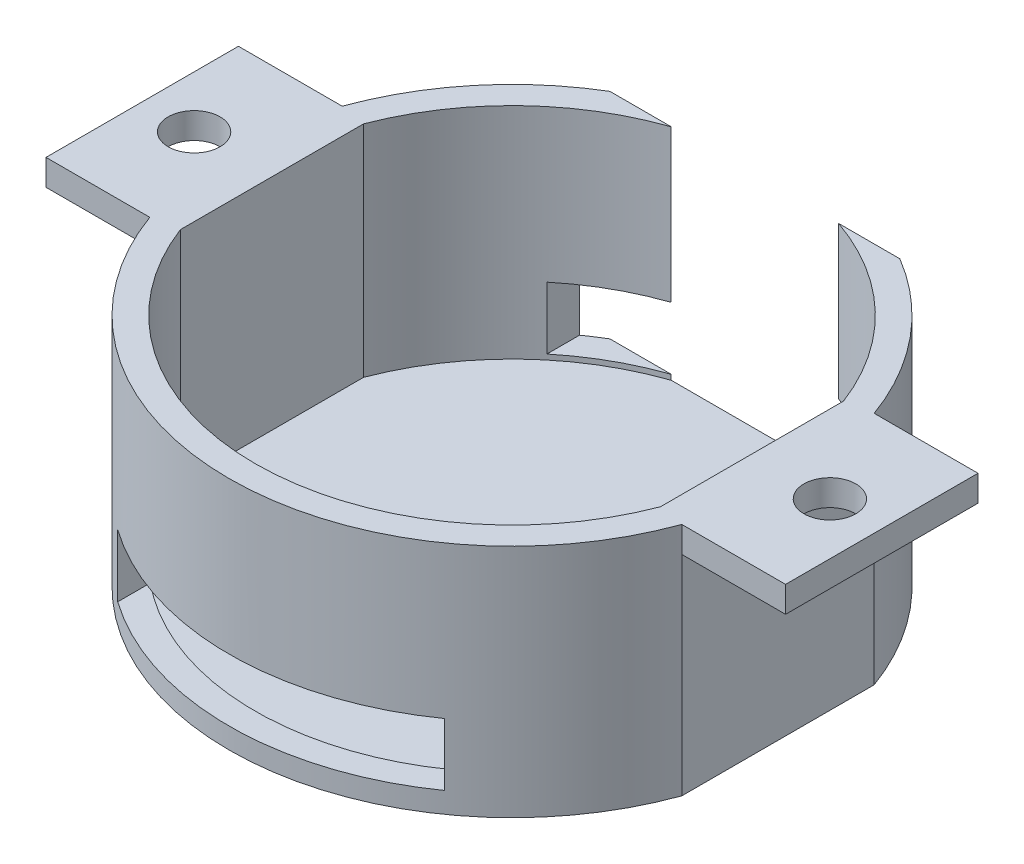
ISO-10303-21;
HEADER;
FILE_DESCRIPTION(('STEP AP214'),'2;1');
FILE_NAME('part.step','',(''),(''),'','','');
FILE_SCHEMA(('AUTOMOTIVE_DESIGN { 1 0 10303 214 1 1 1 1 }'));
ENDSEC;
DATA;
#1=APPLICATION_CONTEXT('core data for automotive mechanical design processes');
#2=APPLICATION_PROTOCOL_DEFINITION('international standard','automotive_design',2000,#1);
#3=PRODUCT_CONTEXT('',#1,'mechanical');
#4=PRODUCT('Part','Part','',(#3));
#5=PRODUCT_RELATED_PRODUCT_CATEGORY('part','',(#4));
#6=PRODUCT_DEFINITION_FORMATION('','',#4);
#7=PRODUCT_DEFINITION_CONTEXT('part definition',#1,'design');
#8=PRODUCT_DEFINITION('design','',#6,#7);
#9=PRODUCT_DEFINITION_SHAPE('','',#8);
#10=(LENGTH_UNIT() NAMED_UNIT(*) SI_UNIT(.MILLI.,.METRE.));
#11=(NAMED_UNIT(*) PLANE_ANGLE_UNIT() SI_UNIT($,.RADIAN.));
#12=(NAMED_UNIT(*) SI_UNIT($,.STERADIAN.) SOLID_ANGLE_UNIT());
#13=UNCERTAINTY_MEASURE_WITH_UNIT(LENGTH_MEASURE(1.E-05),#10,'distance_accuracy_value','');
#14=(GEOMETRIC_REPRESENTATION_CONTEXT(3) GLOBAL_UNCERTAINTY_ASSIGNED_CONTEXT((#13)) GLOBAL_UNIT_ASSIGNED_CONTEXT((#10,
#11,#12)) REPRESENTATION_CONTEXT('',''));
#15=CARTESIAN_POINT('',(0.,0.,0.));
#16=DIRECTION('',(0.,0.,1.));
#17=DIRECTION('',(1.,0.,0.));
#18=AXIS2_PLACEMENT_3D('',#15,#16,#17);
#19=CARTESIAN_POINT('',(-31.477498370648,1.,54.5));
#20=DIRECTION('',(0.,-1.,0.));
#21=DIRECTION('',(1.,0.,0.));
#22=AXIS2_PLACEMENT_3D('',#19,#20,#21);
#23=PLANE('',#22);
#24=CARTESIAN_POINT('',(0.,0.999999999999994,0.));
#25=DIRECTION('',(0.,-1.,0.));
#26=DIRECTION('',(1.,0.,0.));
#27=AXIS2_PLACEMENT_3D('',#24,#25,#26);
#28=CIRCLE('',#27,54.5);
#29=CARTESIAN_POINT('',(27.9257797262097,0.99999999999999,-46.8017182022543));
#30=VERTEX_POINT('',#29);
#31=CARTESIAN_POINT('',(31.477498370648,0.999999999999992,-44.4906405474888));
#32=VERTEX_POINT('',#31);
#33=EDGE_CURVE('E432',#30,#32,#28,.T.);
#34=ORIENTED_EDGE('',*,*,#33,.F.);
#35=DIRECTION('',(-1.,0.,0.));
#36=VECTOR('',#35,1.);
#37=CARTESIAN_POINT('',(-31.477498370648,1.,-46.8017182022543));
#38=LINE('',#37,#36);
#39=CARTESIAN_POINT('',(16.119837881219,0.999999999999994,-46.8017182022542));
#40=VERTEX_POINT('',#39);
#41=EDGE_CURVE('E383',#30,#40,#38,.T.);
#42=ORIENTED_EDGE('',*,*,#41,.T.);
#43=CARTESIAN_POINT('',(0.,0.999999999999994,0.));
#44=DIRECTION('',(0.,-1.,0.));
#45=DIRECTION('',(1.,0.,0.));
#46=AXIS2_PLACEMENT_3D('',#43,#44,#45);
#47=CIRCLE('',#46,49.5);
#48=CARTESIAN_POINT('',(31.477498370648,0.999999999999992,-38.2023179444109));
#49=VERTEX_POINT('',#48);
#50=EDGE_CURVE('E367',#40,#49,#47,.T.);
#51=ORIENTED_EDGE('',*,*,#50,.T.);
#52=DIRECTION('',(0.,0.,-1.));
#53=VECTOR('',#52,1.);
#54=CARTESIAN_POINT('',(31.477498370648,0.999999999999992,54.5));
#55=LINE('',#54,#53);
#56=EDGE_CURVE('E387',#49,#32,#55,.T.);
#57=ORIENTED_EDGE('',*,*,#56,.T.);
#58=EDGE_LOOP('',(#34,#42,#51,#57));
#59=FACE_BOUND('',#58,.T.);
#60=ADVANCED_FACE('F43',(#59),#23,.F.);
#61=CARTESIAN_POINT('',(31.477498370648,13.,54.5));
#62=DIRECTION('',(0.,1.,0.));
#63=DIRECTION('',(-1.,0.,0.));
#64=AXIS2_PLACEMENT_3D('',#61,#62,#63);
#65=PLANE('',#64);
#66=CARTESIAN_POINT('',(0.,13.,0.));
#67=DIRECTION('',(0.,1.,0.));
#68=DIRECTION('',(-1.,0.,0.));
#69=AXIS2_PLACEMENT_3D('',#66,#67,#68);
#70=CIRCLE('',#69,54.5);
#71=CARTESIAN_POINT('',(-27.9257797262097,13.,-46.8017182022542));
#72=VERTEX_POINT('',#71);
#73=CARTESIAN_POINT('',(-31.477498370648,13.,-44.4906405474888));
#74=VERTEX_POINT('',#73);
#75=EDGE_CURVE('E416',#72,#74,#70,.T.);
#76=ORIENTED_EDGE('',*,*,#75,.F.);
#77=DIRECTION('',(1.,0.,0.));
#78=VECTOR('',#77,1.);
#79=CARTESIAN_POINT('',(31.477498370648,13.,-46.8017182022543));
#80=LINE('',#79,#78);
#81=CARTESIAN_POINT('',(-16.119837881219,13.,-46.8017182022542));
#82=VERTEX_POINT('',#81);
#83=EDGE_CURVE('E243',#72,#82,#80,.T.);
#84=ORIENTED_EDGE('',*,*,#83,.T.);
#85=CARTESIAN_POINT('',(0.,13.,0.));
#86=DIRECTION('',(0.,1.,0.));
#87=DIRECTION('',(-1.,0.,0.));
#88=AXIS2_PLACEMENT_3D('',#85,#86,#87);
#89=CIRCLE('',#88,49.5);
#90=CARTESIAN_POINT('',(-31.477498370648,13.,-38.2023179444109));
#91=VERTEX_POINT('',#90);
#92=EDGE_CURVE('E410',#82,#91,#89,.T.);
#93=ORIENTED_EDGE('',*,*,#92,.T.);
#94=DIRECTION('',(0.,0.,-1.));
#95=VECTOR('',#94,1.);
#96=CARTESIAN_POINT('',(-31.477498370648,13.,54.5));
#97=LINE('',#96,#95);
#98=EDGE_CURVE('E396',#91,#74,#97,.T.);
#99=ORIENTED_EDGE('',*,*,#98,.T.);
#100=EDGE_LOOP('',(#76,#84,#93,#99));
#101=FACE_BOUND('',#100,.T.);
#102=ADVANCED_FACE('F559',(#101),#65,.F.);
#103=CARTESIAN_POINT('',(0.,42.3,0.));
#104=DIRECTION('',(0.,-1.,0.));
#105=DIRECTION('',(0.,0.,-1.));
#106=AXIS2_PLACEMENT_3D('',#103,#104,#105);
#107=CYLINDRICAL_SURFACE('',#106,49.5);
#108=DIRECTION('',(0.,-1.,0.));
#109=VECTOR('',#108,1.);
#110=CARTESIAN_POINT('',(-16.119837881219,42.3,-46.8017182022542));
#111=LINE('',#110,#109);
#112=CARTESIAN_POINT('',(-16.119837881219,42.3,-46.8017182022542));
#113=VERTEX_POINT('',#112);
#114=EDGE_CURVE('E374',#113,#82,#111,.T.);
#115=ORIENTED_EDGE('',*,*,#114,.F.);
#116=CARTESIAN_POINT('',(0.,42.3,0.));
#117=DIRECTION('',(0.,1.,0.));
#118=DIRECTION('',(0.,0.,1.));
#119=AXIS2_PLACEMENT_3D('',#116,#117,#118);
#120=CIRCLE('',#119,49.5);
#121=CARTESIAN_POINT('',(-46.25,42.3,-17.6405073623181));
#122=VERTEX_POINT('',#121);
#123=EDGE_CURVE('E258',#113,#122,#120,.T.);
#124=ORIENTED_EDGE('',*,*,#123,.T.);
#125=DIRECTION('',(0.,-1.,0.));
#126=VECTOR('',#125,1.);
#127=CARTESIAN_POINT('',(-46.25,42.3,-17.6405073623181));
#128=LINE('',#127,#126);
#129=CARTESIAN_POINT('',(-46.25,0.,-17.6405073623181));
#130=VERTEX_POINT('',#129);
#131=EDGE_CURVE('E267',#122,#130,#128,.T.);
#132=ORIENTED_EDGE('',*,*,#131,.T.);
#133=CARTESIAN_POINT('',(0.,0.,0.));
#134=DIRECTION('',(0.,1.,0.));
#135=DIRECTION('',(0.,0.,1.));
#136=AXIS2_PLACEMENT_3D('',#133,#134,#135);
#137=CIRCLE('',#136,49.5);
#138=CARTESIAN_POINT('',(-16.119837881219,0.,-46.8017182022542));
#139=VERTEX_POINT('',#138);
#140=EDGE_CURVE('E299',#139,#130,#137,.T.);
#141=ORIENTED_EDGE('',*,*,#140,.F.);
#142=CARTESIAN_POINT('',(-16.119837881219,0.999999999999994,-46.8017182022542));
#143=VERTEX_POINT('',#142);
#144=EDGE_CURVE('E353',#143,#139,#111,.T.);
#145=ORIENTED_EDGE('',*,*,#144,.F.);
#146=CARTESIAN_POINT('',(-31.477498370648,1.,-38.2023179444109));
#147=VERTEX_POINT('',#146);
#148=EDGE_CURVE('E428',#147,#143,#47,.T.);
#149=ORIENTED_EDGE('',*,*,#148,.F.);
#150=DIRECTION('',(0.,-1.,0.));
#151=VECTOR('',#150,1.);
#152=CARTESIAN_POINT('',(-31.477498370648,42.3,-38.2023179444109));
#153=LINE('',#152,#151);
#154=EDGE_CURVE('E402',#91,#147,#153,.T.);
#155=ORIENTED_EDGE('',*,*,#154,.F.);
#156=ORIENTED_EDGE('',*,*,#92,.F.);
#157=EDGE_LOOP('',(#115,#124,#132,#141,#145,#149,#155,#156));
#158=FACE_BOUND('',#157,.T.);
#159=ADVANCED_FACE('F351',(#158),#107,.F.);
#160=CARTESIAN_POINT('',(0.,42.3,0.));
#161=DIRECTION('',(0.,1.,0.));
#162=DIRECTION('',(0.,0.,1.));
#163=AXIS2_PLACEMENT_3D('',#160,#161,#162);
#164=PLANE('',#163);
#165=DIRECTION('',(-1.,0.,0.));
#166=VECTOR('',#165,1.);
#167=CARTESIAN_POINT('',(-27.9257797262097,42.3,-46.8017182022542));
#168=LINE('',#167,#166);
#169=CARTESIAN_POINT('',(-27.9257797262097,42.3,-46.8017182022542));
#170=VERTEX_POINT('',#169);
#171=EDGE_CURVE('E60',#113,#170,#168,.T.);
#172=ORIENTED_EDGE('',*,*,#171,.T.);
#173=CARTESIAN_POINT('',(0.,42.3,0.));
#174=DIRECTION('',(0.,1.,0.));
#175=DIRECTION('',(0.,0.,1.));
#176=AXIS2_PLACEMENT_3D('',#173,#174,#175);
#177=CIRCLE('',#176,54.5);
#178=CARTESIAN_POINT('',(-51.25,42.3,-18.5388106414624));
#179=VERTEX_POINT('',#178);
#180=EDGE_CURVE('E255',#170,#179,#177,.T.);
#181=ORIENTED_EDGE('',*,*,#180,.T.);
#182=DIRECTION('',(1.,0.,0.));
#183=VECTOR('',#182,1.);
#184=CARTESIAN_POINT('',(-71.25,42.3,-18.5388106414624));
#185=LINE('',#184,#183);
#186=CARTESIAN_POINT('',(-71.25,42.3,-18.5388106414624));
#187=VERTEX_POINT('',#186);
#188=EDGE_CURVE('E482',#187,#179,#185,.T.);
#189=ORIENTED_EDGE('',*,*,#188,.F.);
#190=DIRECTION('',(0.,0.,-1.));
#191=VECTOR('',#190,1.);
#192=CARTESIAN_POINT('',(-71.25,42.3,-18.5388106414624));
#193=LINE('',#192,#191);
#194=CARTESIAN_POINT('',(-71.25,42.3,18.5388106414624));
#195=VERTEX_POINT('',#194);
#196=EDGE_CURVE('E480',#195,#187,#193,.T.);
#197=ORIENTED_EDGE('',*,*,#196,.F.);
#198=DIRECTION('',(1.,0.,0.));
#199=VECTOR('',#198,1.);
#200=CARTESIAN_POINT('',(-71.25,42.3,18.5388106414624));
#201=LINE('',#200,#199);
#202=CARTESIAN_POINT('',(-51.25,42.3,18.5388106414624));
#203=VERTEX_POINT('',#202);
#204=EDGE_CURVE('E486',#195,#203,#201,.T.);
#205=ORIENTED_EDGE('',*,*,#204,.T.);
#206=CARTESIAN_POINT('',(0.,42.3,0.));
#207=DIRECTION('',(0.,1.,0.));
#208=DIRECTION('',(0.,0.,1.));
#209=AXIS2_PLACEMENT_3D('',#206,#207,#208);
#210=CIRCLE('',#209,54.5);
#211=CARTESIAN_POINT('',(51.25,42.3,18.5388106414624));
#212=VERTEX_POINT('',#211);
#213=EDGE_CURVE('E270',#203,#212,#210,.T.);
#214=ORIENTED_EDGE('',*,*,#213,.T.);
#215=DIRECTION('',(-1.,0.,0.));
#216=VECTOR('',#215,1.);
#217=CARTESIAN_POINT('',(71.25,42.3,18.5388106414624));
#218=LINE('',#217,#216);
#219=CARTESIAN_POINT('',(71.25,42.3,18.5388106414624));
#220=VERTEX_POINT('',#219);
#221=EDGE_CURVE('E458',#220,#212,#218,.T.);
#222=ORIENTED_EDGE('',*,*,#221,.F.);
#223=DIRECTION('',(0.,0.,1.));
#224=VECTOR('',#223,1.);
#225=CARTESIAN_POINT('',(71.25,42.3,18.5388106414624));
#226=LINE('',#225,#224);
#227=CARTESIAN_POINT('',(71.25,42.3,-18.5388106414624));
#228=VERTEX_POINT('',#227);
#229=EDGE_CURVE('E456',#228,#220,#226,.T.);
#230=ORIENTED_EDGE('',*,*,#229,.F.);
#231=DIRECTION('',(-1.,0.,0.));
#232=VECTOR('',#231,1.);
#233=CARTESIAN_POINT('',(71.25,42.3,-18.5388106414624));
#234=LINE('',#233,#232);
#235=CARTESIAN_POINT('',(51.25,42.3,-18.5388106414624));
#236=VERTEX_POINT('',#235);
#237=EDGE_CURVE('E463',#228,#236,#234,.T.);
#238=ORIENTED_EDGE('',*,*,#237,.T.);
#239=CARTESIAN_POINT('',(27.9257797262097,42.3,-46.8017182022542));
#240=VERTEX_POINT('',#239);
#241=EDGE_CURVE('E266',#236,#240,#177,.T.);
#242=ORIENTED_EDGE('',*,*,#241,.T.);
#243=CARTESIAN_POINT('',(16.119837881219,42.3,-46.8017182022542));
#244=VERTEX_POINT('',#243);
#245=EDGE_CURVE('E259',#240,#244,#168,.T.);
#246=ORIENTED_EDGE('',*,*,#245,.T.);
#247=CARTESIAN_POINT('',(46.25,42.3,-17.6405073623181));
#248=VERTEX_POINT('',#247);
#249=EDGE_CURVE('E311',#248,#244,#120,.T.);
#250=ORIENTED_EDGE('',*,*,#249,.F.);
#251=DIRECTION('',(0.,0.,-1.));
#252=VECTOR('',#251,1.);
#253=CARTESIAN_POINT('',(46.25,42.3,-17.6405073623181));
#254=LINE('',#253,#252);
#255=CARTESIAN_POINT('',(46.25,42.3,17.6405073623182));
#256=VERTEX_POINT('',#255);
#257=EDGE_CURVE('E319',#256,#248,#254,.T.);
#258=ORIENTED_EDGE('',*,*,#257,.F.);
#259=CARTESIAN_POINT('',(0.,42.3,0.));
#260=DIRECTION('',(0.,1.,0.));
#261=DIRECTION('',(0.,0.,1.));
#262=AXIS2_PLACEMENT_3D('',#259,#260,#261);
#263=CIRCLE('',#262,49.5);
#264=CARTESIAN_POINT('',(-46.25,42.3,17.6405073623181));
#265=VERTEX_POINT('',#264);
#266=EDGE_CURVE('E316',#265,#256,#263,.T.);
#267=ORIENTED_EDGE('',*,*,#266,.F.);
#268=DIRECTION('',(0.,0.,1.));
#269=VECTOR('',#268,1.);
#270=CARTESIAN_POINT('',(-46.25,42.3,-17.6405073623181));
#271=LINE('',#270,#269);
#272=EDGE_CURVE('E314',#122,#265,#271,.T.);
#273=ORIENTED_EDGE('',*,*,#272,.F.);
#274=ORIENTED_EDGE('',*,*,#123,.F.);
#275=EDGE_LOOP('',(#172,#181,#189,#197,#205,#214,#222,#230,#238,#242,#246,#250,#258,#267,#273,#274));
#276=FACE_BOUND('',#275,.T.);
#277=CARTESIAN_POINT('',(61.25,42.3,0.));
#278=DIRECTION('',(0.,1.,0.));
#279=DIRECTION('',(0.,0.,1.));
#280=AXIS2_PLACEMENT_3D('',#277,#278,#279);
#281=CIRCLE('',#280,5.);
#282=CARTESIAN_POINT('',(61.25,42.3,5.));
#283=VERTEX_POINT('',#282);
#284=EDGE_CURVE('E436',#283,#283,#281,.T.);
#285=ORIENTED_EDGE('',*,*,#284,.F.);
#286=EDGE_LOOP('',(#285));
#287=FACE_BOUND('',#286,.T.);
#288=CARTESIAN_POINT('',(-61.25,42.3,0.));
#289=DIRECTION('',(0.,1.,0.));
#290=DIRECTION('',(0.,0.,1.));
#291=AXIS2_PLACEMENT_3D('',#288,#289,#290);
#292=CIRCLE('',#291,5.);
#293=CARTESIAN_POINT('',(-61.25,42.3,5.));
#294=VERTEX_POINT('',#293);
#295=EDGE_CURVE('E442',#294,#294,#292,.T.);
#296=ORIENTED_EDGE('',*,*,#295,.F.);
#297=EDGE_LOOP('',(#296));
#298=FACE_BOUND('',#297,.T.);
#299=ADVANCED_FACE('F252',(#276,#287,#298),#164,.T.);
#300=CARTESIAN_POINT('',(0.,42.3,0.));
#301=DIRECTION('',(0.,-1.,0.));
#302=DIRECTION('',(0.,0.,-1.));
#303=AXIS2_PLACEMENT_3D('',#300,#301,#302);
#304=CYLINDRICAL_SURFACE('',#303,54.5);
#305=CARTESIAN_POINT('',(0.,-3.,0.));
#306=DIRECTION('',(0.,-1.,0.));
#307=DIRECTION('',(0.,0.,-1.));
#308=AXIS2_PLACEMENT_3D('',#305,#306,#307);
#309=CIRCLE('',#308,54.5);
#310=CARTESIAN_POINT('',(27.9257797262097,-3.,-46.8017182022542));
#311=VERTEX_POINT('',#310);
#312=CARTESIAN_POINT('',(51.25,-3.,-18.5388106414624));
#313=VERTEX_POINT('',#312);
#314=EDGE_CURVE('E47',#311,#313,#309,.T.);
#315=ORIENTED_EDGE('',*,*,#314,.F.);
#316=DIRECTION('',(0.,-1.,0.));
#317=VECTOR('',#316,1.);
#318=CARTESIAN_POINT('',(27.9257797262097,42.3,-46.8017182022542));
#319=LINE('',#318,#317);
#320=EDGE_CURVE('E378',#311,#30,#319,.F.);
#321=ORIENTED_EDGE('',*,*,#320,.T.);
#322=ORIENTED_EDGE('',*,*,#33,.T.);
#323=DIRECTION('',(0.,-1.,0.));
#324=VECTOR('',#323,1.);
#325=CARTESIAN_POINT('',(31.477498370648,42.3,-44.4906405474888));
#326=LINE('',#325,#324);
#327=CARTESIAN_POINT('',(31.477498370648,13.,-44.4906405474888));
#328=VERTEX_POINT('',#327);
#329=EDGE_CURVE('E425',#32,#328,#326,.F.);
#330=ORIENTED_EDGE('',*,*,#329,.T.);
#331=CARTESIAN_POINT('',(27.9257797262097,13.,-46.8017182022543));
#332=VERTEX_POINT('',#331);
#333=EDGE_CURVE('E417',#328,#332,#70,.T.);
#334=ORIENTED_EDGE('',*,*,#333,.T.);
#335=EDGE_CURVE('E376',#332,#240,#319,.F.);
#336=ORIENTED_EDGE('',*,*,#335,.T.);
#337=ORIENTED_EDGE('',*,*,#241,.F.);
#338=DIRECTION('',(0.,-1.,0.));
#339=VECTOR('',#338,1.);
#340=CARTESIAN_POINT('',(51.25,42.3,-18.5388106414624));
#341=LINE('',#340,#339);
#342=CARTESIAN_POINT('',(51.25,37.3,-18.5388106414624));
#343=VERTEX_POINT('',#342);
#344=EDGE_CURVE('E278',#236,#343,#341,.T.);
#345=ORIENTED_EDGE('',*,*,#344,.T.);
#346=EDGE_CURVE('E277',#343,#313,#341,.T.);
#347=ORIENTED_EDGE('',*,*,#346,.T.);
#348=EDGE_LOOP('',(#315,#321,#322,#330,#334,#336,#337,#345,#347));
#349=FACE_BOUND('',#348,.T.);
#350=ADVANCED_FACE('F45',(#349),#304,.T.);
#351=ORIENTED_EDGE('',*,*,#180,.F.);
#352=DIRECTION('',(0.,-1.,0.));
#353=VECTOR('',#352,1.);
#354=CARTESIAN_POINT('',(-27.9257797262097,42.3,-46.8017182022542));
#355=LINE('',#354,#353);
#356=EDGE_CURVE('E240',#170,#72,#355,.T.);
#357=ORIENTED_EDGE('',*,*,#356,.T.);
#358=ORIENTED_EDGE('',*,*,#75,.T.);
#359=DIRECTION('',(0.,-1.,0.));
#360=VECTOR('',#359,1.);
#361=CARTESIAN_POINT('',(-31.477498370648,42.3,-44.4906405474888));
#362=LINE('',#361,#360);
#363=CARTESIAN_POINT('',(-31.477498370648,1.,-44.4906405474888));
#364=VERTEX_POINT('',#363);
#365=EDGE_CURVE('E407',#74,#364,#362,.T.);
#366=ORIENTED_EDGE('',*,*,#365,.T.);
#367=CARTESIAN_POINT('',(-27.9257797262097,0.999999999999994,-46.8017182022542));
#368=VERTEX_POINT('',#367);
#369=EDGE_CURVE('E433',#364,#368,#28,.T.);
#370=ORIENTED_EDGE('',*,*,#369,.T.);
#371=CARTESIAN_POINT('',(-27.9257797262097,-3.,-46.8017182022542));
#372=VERTEX_POINT('',#371);
#373=EDGE_CURVE('E248',#368,#372,#355,.T.);
#374=ORIENTED_EDGE('',*,*,#373,.T.);
#375=CARTESIAN_POINT('',(-51.25,-3.,-18.5388106414625));
#376=VERTEX_POINT('',#375);
#377=EDGE_CURVE('E297',#376,#372,#309,.T.);
#378=ORIENTED_EDGE('',*,*,#377,.F.);
#379=DIRECTION('',(0.,-1.,0.));
#380=VECTOR('',#379,1.);
#381=CARTESIAN_POINT('',(-51.25,42.3,-18.5388106414624));
#382=LINE('',#381,#380);
#383=CARTESIAN_POINT('',(-51.25,37.3,-18.5388106414624));
#384=VERTEX_POINT('',#383);
#385=EDGE_CURVE('E287',#384,#376,#382,.T.);
#386=ORIENTED_EDGE('',*,*,#385,.F.);
#387=EDGE_CURVE('E264',#179,#384,#382,.T.);
#388=ORIENTED_EDGE('',*,*,#387,.F.);
#389=EDGE_LOOP('',(#351,#357,#358,#366,#370,#374,#378,#386,#388));
#390=FACE_BOUND('',#389,.T.);
#391=ADVANCED_FACE('F261',(#390),#304,.T.);
#392=CARTESIAN_POINT('',(0.,-3.,0.));
#393=DIRECTION('',(0.,-1.,0.));
#394=DIRECTION('',(0.,0.,-1.));
#395=AXIS2_PLACEMENT_3D('',#392,#393,#394);
#396=PLANE('',#395);
#397=DIRECTION('',(-1.,0.,0.));
#398=VECTOR('',#397,1.);
#399=CARTESIAN_POINT('',(0.,-3.,-46.8017182022542));
#400=LINE('',#399,#398);
#401=EDGE_CURVE('E375',#311,#372,#400,.T.);
#402=ORIENTED_EDGE('',*,*,#401,.F.);
#403=ORIENTED_EDGE('',*,*,#314,.T.);
#404=DIRECTION('',(0.,0.,1.));
#405=VECTOR('',#404,1.);
#406=CARTESIAN_POINT('',(51.25,-3.,0.));
#407=LINE('',#406,#405);
#408=CARTESIAN_POINT('',(51.25,-3.,18.5388106414625));
#409=VERTEX_POINT('',#408);
#410=EDGE_CURVE('E306',#313,#409,#407,.T.);
#411=ORIENTED_EDGE('',*,*,#410,.T.);
#412=CARTESIAN_POINT('',(-51.25,-3.,18.5388106414624));
#413=VERTEX_POINT('',#412);
#414=EDGE_CURVE('E300',#409,#413,#309,.T.);
#415=ORIENTED_EDGE('',*,*,#414,.T.);
#416=DIRECTION('',(0.,0.,1.));
#417=VECTOR('',#416,1.);
#418=CARTESIAN_POINT('',(-51.25,-3.,0.));
#419=LINE('',#418,#417);
#420=EDGE_CURVE('E305',#376,#413,#419,.T.);
#421=ORIENTED_EDGE('',*,*,#420,.F.);
#422=ORIENTED_EDGE('',*,*,#377,.T.);
#423=EDGE_LOOP('',(#402,#403,#411,#415,#421,#422));
#424=FACE_BOUND('',#423,.T.);
#425=ADVANCED_FACE('F498',(#424),#396,.T.);
#426=ORIENTED_EDGE('',*,*,#148,.T.);
#427=EDGE_CURVE('E372',#143,#368,#38,.T.);
#428=ORIENTED_EDGE('',*,*,#427,.T.);
#429=ORIENTED_EDGE('',*,*,#369,.F.);
#430=DIRECTION('',(0.,0.,-1.));
#431=VECTOR('',#430,1.);
#432=CARTESIAN_POINT('',(-31.477498370648,1.,54.5));
#433=LINE('',#432,#431);
#434=EDGE_CURVE('E400',#147,#364,#433,.T.);
#435=ORIENTED_EDGE('',*,*,#434,.F.);
#436=EDGE_LOOP('',(#426,#428,#429,#435));
#437=FACE_BOUND('',#436,.T.);
#438=ADVANCED_FACE('F557',(#437),#23,.F.);
#439=CARTESIAN_POINT('',(31.477498370648,13.,-38.2023179444109));
#440=VERTEX_POINT('',#439);
#441=CARTESIAN_POINT('',(16.119837881219,13.,-46.8017182022542));
#442=VERTEX_POINT('',#441);
#443=EDGE_CURVE('E411',#440,#442,#89,.T.);
#444=ORIENTED_EDGE('',*,*,#443,.T.);
#445=EDGE_CURVE('E68',#442,#332,#80,.T.);
#446=ORIENTED_EDGE('',*,*,#445,.T.);
#447=ORIENTED_EDGE('',*,*,#333,.F.);
#448=DIRECTION('',(0.,0.,-1.));
#449=VECTOR('',#448,1.);
#450=CARTESIAN_POINT('',(31.477498370648,13.,54.5));
#451=LINE('',#450,#449);
#452=EDGE_CURVE('E392',#440,#328,#451,.T.);
#453=ORIENTED_EDGE('',*,*,#452,.F.);
#454=EDGE_LOOP('',(#444,#446,#447,#453));
#455=FACE_BOUND('',#454,.T.);
#456=ADVANCED_FACE('F555',(#455),#65,.F.);
#457=CARTESIAN_POINT('',(51.25,42.3,-18.5388106414624));
#458=DIRECTION('',(-1.,0.,0.));
#459=DIRECTION('',(0.,0.,1.));
#460=AXIS2_PLACEMENT_3D('',#457,#458,#459);
#461=PLANE('',#460);
#462=DIRECTION('',(0.,0.,-1.));
#463=VECTOR('',#462,1.);
#464=CARTESIAN_POINT('',(51.25,37.3,18.5388106414624));
#465=LINE('',#464,#463);
#466=CARTESIAN_POINT('',(51.25,37.3,18.5388106414624));
#467=VERTEX_POINT('',#466);
#468=EDGE_CURVE('E448',#467,#343,#465,.T.);
#469=ORIENTED_EDGE('',*,*,#468,.F.);
#470=DIRECTION('',(0.,-1.,0.));
#471=VECTOR('',#470,1.);
#472=CARTESIAN_POINT('',(51.25,42.3,18.5388106414624));
#473=LINE('',#472,#471);
#474=EDGE_CURVE('E280',#467,#409,#473,.T.);
#475=ORIENTED_EDGE('',*,*,#474,.T.);
#476=ORIENTED_EDGE('',*,*,#410,.F.);
#477=ORIENTED_EDGE('',*,*,#346,.F.);
#478=EDGE_LOOP('',(#469,#475,#476,#477));
#479=FACE_BOUND('',#478,.T.);
#480=ADVANCED_FACE('F505',(#479),#461,.F.);
#481=CARTESIAN_POINT('',(-51.25,42.3,-18.5388106414624));
#482=DIRECTION('',(1.,0.,0.));
#483=DIRECTION('',(0.,0.,-1.));
#484=AXIS2_PLACEMENT_3D('',#481,#482,#483);
#485=PLANE('',#484);
#486=DIRECTION('',(0.,0.,1.));
#487=VECTOR('',#486,1.);
#488=CARTESIAN_POINT('',(-51.25,37.3,-18.5388106414624));
#489=LINE('',#488,#487);
#490=CARTESIAN_POINT('',(-51.25,37.3,18.5388106414624));
#491=VERTEX_POINT('',#490);
#492=EDGE_CURVE('E472',#384,#491,#489,.T.);
#493=ORIENTED_EDGE('',*,*,#492,.F.);
#494=ORIENTED_EDGE('',*,*,#385,.T.);
#495=ORIENTED_EDGE('',*,*,#420,.T.);
#496=DIRECTION('',(0.,-1.,0.));
#497=VECTOR('',#496,1.);
#498=CARTESIAN_POINT('',(-51.25,42.3,18.5388106414624));
#499=LINE('',#498,#497);
#500=EDGE_CURVE('E284',#491,#413,#499,.T.);
#501=ORIENTED_EDGE('',*,*,#500,.F.);
#502=EDGE_LOOP('',(#493,#494,#495,#501));
#503=FACE_BOUND('',#502,.T.);
#504=ADVANCED_FACE('F513',(#503),#485,.F.);
#505=CARTESIAN_POINT('',(0.,42.3,0.));
#506=DIRECTION('',(0.,-1.,0.));
#507=DIRECTION('',(0.,0.,-1.));
#508=AXIS2_PLACEMENT_3D('',#505,#506,#507);
#509=CYLINDRICAL_SURFACE('',#508,54.5);
#510=DIRECTION('',(0.,-1.,0.));
#511=VECTOR('',#510,1.);
#512=CARTESIAN_POINT('',(-31.477498370648,42.3,44.4906405474888));
#513=LINE('',#512,#511);
#514=CARTESIAN_POINT('',(-31.477498370648,1.,44.4906405474888));
#515=VERTEX_POINT('',#514);
#516=CARTESIAN_POINT('',(-31.477498370648,13.,44.4906405474888));
#517=VERTEX_POINT('',#516);
#518=EDGE_CURVE('E404',#515,#517,#513,.F.);
#519=ORIENTED_EDGE('',*,*,#518,.T.);
#520=CARTESIAN_POINT('',(0.,13.,0.));
#521=DIRECTION('',(0.,1.,0.));
#522=DIRECTION('',(-1.,0.,0.));
#523=AXIS2_PLACEMENT_3D('',#520,#521,#522);
#524=CIRCLE('',#523,54.5);
#525=CARTESIAN_POINT('',(31.477498370648,13.,44.4906405474888));
#526=VERTEX_POINT('',#525);
#527=EDGE_CURVE('E414',#517,#526,#524,.T.);
#528=ORIENTED_EDGE('',*,*,#527,.T.);
#529=DIRECTION('',(0.,-1.,0.));
#530=VECTOR('',#529,1.);
#531=CARTESIAN_POINT('',(31.477498370648,42.3,44.4906405474888));
#532=LINE('',#531,#530);
#533=CARTESIAN_POINT('',(31.477498370648,0.999999999999992,44.4906405474888));
#534=VERTEX_POINT('',#533);
#535=EDGE_CURVE('E422',#526,#534,#532,.T.);
#536=ORIENTED_EDGE('',*,*,#535,.T.);
#537=CARTESIAN_POINT('',(0.,0.999999999999994,0.));
#538=DIRECTION('',(0.,-1.,0.));
#539=DIRECTION('',(1.,0.,0.));
#540=AXIS2_PLACEMENT_3D('',#537,#538,#539);
#541=CIRCLE('',#540,54.5);
#542=EDGE_CURVE('E430',#534,#515,#541,.T.);
#543=ORIENTED_EDGE('',*,*,#542,.T.);
#544=EDGE_LOOP('',(#519,#528,#536,#543));
#545=FACE_BOUND('',#544,.T.);
#546=EDGE_CURVE('E285',#203,#491,#499,.T.);
#547=ORIENTED_EDGE('',*,*,#546,.T.);
#548=ORIENTED_EDGE('',*,*,#500,.T.);
#549=ORIENTED_EDGE('',*,*,#414,.F.);
#550=ORIENTED_EDGE('',*,*,#474,.F.);
#551=EDGE_CURVE('E281',#212,#467,#473,.T.);
#552=ORIENTED_EDGE('',*,*,#551,.F.);
#553=ORIENTED_EDGE('',*,*,#213,.F.);
#554=EDGE_LOOP('',(#547,#548,#549,#550,#552,#553));
#555=FACE_BOUND('',#554,.T.);
#556=ADVANCED_FACE('F509',(#545,#555),#509,.T.);
#557=DIRECTION('',(0.,-1.,0.));
#558=VECTOR('',#557,1.);
#559=CARTESIAN_POINT('',(16.119837881219,42.3,-46.8017182022542));
#560=LINE('',#559,#558);
#561=CARTESIAN_POINT('',(16.119837881219,0.,-46.8017182022542));
#562=VERTEX_POINT('',#561);
#563=EDGE_CURVE('E247',#562,#40,#560,.F.);
#564=ORIENTED_EDGE('',*,*,#563,.F.);
#565=CARTESIAN_POINT('',(46.25,0.,-17.6405073623181));
#566=VERTEX_POINT('',#565);
#567=EDGE_CURVE('E322',#566,#562,#137,.T.);
#568=ORIENTED_EDGE('',*,*,#567,.F.);
#569=DIRECTION('',(0.,-1.,0.));
#570=VECTOR('',#569,1.);
#571=CARTESIAN_POINT('',(46.25,42.3,-17.6405073623181));
#572=LINE('',#571,#570);
#573=EDGE_CURVE('E321',#248,#566,#572,.T.);
#574=ORIENTED_EDGE('',*,*,#573,.F.);
#575=ORIENTED_EDGE('',*,*,#249,.T.);
#576=EDGE_CURVE('E371',#442,#244,#560,.F.);
#577=ORIENTED_EDGE('',*,*,#576,.F.);
#578=ORIENTED_EDGE('',*,*,#443,.F.);
#579=DIRECTION('',(0.,-1.,0.));
#580=VECTOR('',#579,1.);
#581=CARTESIAN_POINT('',(31.477498370648,42.3,-38.2023179444109));
#582=LINE('',#581,#580);
#583=EDGE_CURVE('E420',#49,#440,#582,.F.);
#584=ORIENTED_EDGE('',*,*,#583,.F.);
#585=ORIENTED_EDGE('',*,*,#50,.F.);
#586=EDGE_LOOP('',(#564,#568,#574,#575,#577,#578,#584,#585));
#587=FACE_BOUND('',#586,.T.);
#588=ADVANCED_FACE('F364',(#587),#107,.F.);
#589=CARTESIAN_POINT('',(-46.25,42.3,-17.6405073623181));
#590=DIRECTION('',(1.,0.,0.));
#591=DIRECTION('',(0.,0.,-1.));
#592=AXIS2_PLACEMENT_3D('',#589,#590,#591);
#593=PLANE('',#592);
#594=DIRECTION('',(0.,0.,1.));
#595=VECTOR('',#594,1.);
#596=CARTESIAN_POINT('',(-46.25,0.,-17.6405073623181));
#597=LINE('',#596,#595);
#598=CARTESIAN_POINT('',(-46.25,0.,17.6405073623181));
#599=VERTEX_POINT('',#598);
#600=EDGE_CURVE('E325',#130,#599,#597,.T.);
#601=ORIENTED_EDGE('',*,*,#600,.F.);
#602=ORIENTED_EDGE('',*,*,#131,.F.);
#603=ORIENTED_EDGE('',*,*,#272,.T.);
#604=DIRECTION('',(0.,-1.,0.));
#605=VECTOR('',#604,1.);
#606=CARTESIAN_POINT('',(-46.25,42.3,17.6405073623181));
#607=LINE('',#606,#605);
#608=EDGE_CURVE('E272',#265,#599,#607,.T.);
#609=ORIENTED_EDGE('',*,*,#608,.T.);
#610=EDGE_LOOP('',(#601,#602,#603,#609));
#611=FACE_BOUND('',#610,.T.);
#612=ADVANCED_FACE('F340',(#611),#593,.T.);
#613=CARTESIAN_POINT('',(0.,42.3,0.));
#614=DIRECTION('',(0.,-1.,0.));
#615=DIRECTION('',(0.,0.,-1.));
#616=AXIS2_PLACEMENT_3D('',#613,#614,#615);
#617=CYLINDRICAL_SURFACE('',#616,49.5);
#618=CARTESIAN_POINT('',(0.,0.999999999999994,0.));
#619=DIRECTION('',(0.,-1.,0.));
#620=DIRECTION('',(1.,0.,0.));
#621=AXIS2_PLACEMENT_3D('',#618,#619,#620);
#622=CIRCLE('',#621,49.5);
#623=CARTESIAN_POINT('',(31.477498370648,0.999999999999992,38.2023179444109));
#624=VERTEX_POINT('',#623);
#625=CARTESIAN_POINT('',(-31.477498370648,1.,38.2023179444109));
#626=VERTEX_POINT('',#625);
#627=EDGE_CURVE('E53',#624,#626,#622,.T.);
#628=ORIENTED_EDGE('',*,*,#627,.F.);
#629=DIRECTION('',(0.,-1.,0.));
#630=VECTOR('',#629,1.);
#631=CARTESIAN_POINT('',(31.477498370648,42.3,38.2023179444109));
#632=LINE('',#631,#630);
#633=CARTESIAN_POINT('',(31.477498370648,13.,38.2023179444109));
#634=VERTEX_POINT('',#633);
#635=EDGE_CURVE('E293',#634,#624,#632,.T.);
#636=ORIENTED_EDGE('',*,*,#635,.F.);
#637=CARTESIAN_POINT('',(0.,13.,0.));
#638=DIRECTION('',(0.,1.,0.));
#639=DIRECTION('',(-1.,0.,0.));
#640=AXIS2_PLACEMENT_3D('',#637,#638,#639);
#641=CIRCLE('',#640,49.5);
#642=CARTESIAN_POINT('',(-31.477498370648,13.,38.2023179444109));
#643=VERTEX_POINT('',#642);
#644=EDGE_CURVE('E291',#643,#634,#641,.T.);
#645=ORIENTED_EDGE('',*,*,#644,.F.);
#646=DIRECTION('',(0.,-1.,0.));
#647=VECTOR('',#646,1.);
#648=CARTESIAN_POINT('',(-31.477498370648,42.3,38.2023179444109));
#649=LINE('',#648,#647);
#650=EDGE_CURVE('E289',#626,#643,#649,.F.);
#651=ORIENTED_EDGE('',*,*,#650,.F.);
#652=EDGE_LOOP('',(#628,#636,#645,#651));
#653=FACE_BOUND('',#652,.T.);
#654=CARTESIAN_POINT('',(0.,0.,0.));
#655=DIRECTION('',(0.,1.,0.));
#656=DIRECTION('',(0.,0.,1.));
#657=AXIS2_PLACEMENT_3D('',#654,#655,#656);
#658=CIRCLE('',#657,49.5);
#659=CARTESIAN_POINT('',(46.25,0.,17.6405073623182));
#660=VERTEX_POINT('',#659);
#661=EDGE_CURVE('E328',#599,#660,#658,.T.);
#662=ORIENTED_EDGE('',*,*,#661,.F.);
#663=ORIENTED_EDGE('',*,*,#608,.F.);
#664=ORIENTED_EDGE('',*,*,#266,.T.);
#665=DIRECTION('',(0.,-1.,0.));
#666=VECTOR('',#665,1.);
#667=CARTESIAN_POINT('',(46.25,42.3,17.6405073623182));
#668=LINE('',#667,#666);
#669=EDGE_CURVE('E335',#256,#660,#668,.T.);
#670=ORIENTED_EDGE('',*,*,#669,.T.);
#671=EDGE_LOOP('',(#662,#663,#664,#670));
#672=FACE_BOUND('',#671,.T.);
#673=ADVANCED_FACE('F344',(#653,#672),#617,.F.);
#674=CARTESIAN_POINT('',(46.25,42.3,-17.6405073623181));
#675=DIRECTION('',(-1.,0.,0.));
#676=DIRECTION('',(0.,0.,1.));
#677=AXIS2_PLACEMENT_3D('',#674,#675,#676);
#678=PLANE('',#677);
#679=DIRECTION('',(0.,0.,-1.));
#680=VECTOR('',#679,1.);
#681=CARTESIAN_POINT('',(46.25,0.,-17.6405073623181));
#682=LINE('',#681,#680);
#683=EDGE_CURVE('E331',#660,#566,#682,.T.);
#684=ORIENTED_EDGE('',*,*,#683,.F.);
#685=ORIENTED_EDGE('',*,*,#669,.F.);
#686=ORIENTED_EDGE('',*,*,#257,.T.);
#687=ORIENTED_EDGE('',*,*,#573,.T.);
#688=EDGE_LOOP('',(#684,#685,#686,#687));
#689=FACE_BOUND('',#688,.T.);
#690=ADVANCED_FACE('F360',(#689),#678,.T.);
#691=CARTESIAN_POINT('',(0.,0.,0.));
#692=DIRECTION('',(0.,-1.,0.));
#693=DIRECTION('',(0.,0.,-1.));
#694=AXIS2_PLACEMENT_3D('',#691,#692,#693);
#695=PLANE('',#694);
#696=ORIENTED_EDGE('',*,*,#567,.T.);
#697=DIRECTION('',(-1.,0.,0.));
#698=VECTOR('',#697,1.);
#699=CARTESIAN_POINT('',(0.,0.,-46.8017182022542));
#700=LINE('',#699,#698);
#701=EDGE_CURVE('E11',#562,#139,#700,.T.);
#702=ORIENTED_EDGE('',*,*,#701,.T.);
#703=ORIENTED_EDGE('',*,*,#140,.T.);
#704=ORIENTED_EDGE('',*,*,#600,.T.);
#705=ORIENTED_EDGE('',*,*,#661,.T.);
#706=ORIENTED_EDGE('',*,*,#683,.T.);
#707=EDGE_LOOP('',(#696,#702,#703,#704,#705,#706));
#708=FACE_BOUND('',#707,.T.);
#709=ADVANCED_FACE('F347',(#708),#695,.F.);
#710=CARTESIAN_POINT('',(-71.25,42.3,-18.5388106414624));
#711=DIRECTION('',(0.,0.,1.));
#712=DIRECTION('',(1.,0.,0.));
#713=AXIS2_PLACEMENT_3D('',#710,#711,#712);
#714=PLANE('',#713);
#715=ORIENTED_EDGE('',*,*,#387,.T.);
#716=DIRECTION('',(1.,0.,0.));
#717=VECTOR('',#716,1.);
#718=CARTESIAN_POINT('',(-71.25,37.3,-18.5388106414624));
#719=LINE('',#718,#717);
#720=CARTESIAN_POINT('',(-71.25,37.3,-18.5388106414624));
#721=VERTEX_POINT('',#720);
#722=EDGE_CURVE('E491',#721,#384,#719,.T.);
#723=ORIENTED_EDGE('',*,*,#722,.F.);
#724=DIRECTION('',(0.,-1.,0.));
#725=VECTOR('',#724,1.);
#726=CARTESIAN_POINT('',(-71.25,42.3,-18.5388106414624));
#727=LINE('',#726,#725);
#728=EDGE_CURVE('E473',#187,#721,#727,.T.);
#729=ORIENTED_EDGE('',*,*,#728,.F.);
#730=ORIENTED_EDGE('',*,*,#188,.T.);
#731=EDGE_LOOP('',(#715,#723,#729,#730));
#732=FACE_BOUND('',#731,.T.);
#733=ADVANCED_FACE('F525',(#732),#714,.F.);
#734=CARTESIAN_POINT('',(-71.25,37.3,-18.5388106414624));
#735=DIRECTION('',(0.,1.,0.));
#736=DIRECTION('',(0.,0.,1.));
#737=AXIS2_PLACEMENT_3D('',#734,#735,#736);
#738=PLANE('',#737);
#739=CARTESIAN_POINT('',(-61.25,37.3,0.));
#740=DIRECTION('',(0.,1.,0.));
#741=DIRECTION('',(0.,0.,1.));
#742=AXIS2_PLACEMENT_3D('',#739,#740,#741);
#743=CIRCLE('',#742,5.);
#744=CARTESIAN_POINT('',(-61.25,37.3,5.));
#745=VERTEX_POINT('',#744);
#746=EDGE_CURVE('E445',#745,#745,#743,.F.);
#747=ORIENTED_EDGE('',*,*,#746,.F.);
#748=EDGE_LOOP('',(#747));
#749=FACE_BOUND('',#748,.T.);
#750=ORIENTED_EDGE('',*,*,#492,.T.);
#751=DIRECTION('',(1.,0.,0.));
#752=VECTOR('',#751,1.);
#753=CARTESIAN_POINT('',(-71.25,37.3,18.5388106414624));
#754=LINE('',#753,#752);
#755=CARTESIAN_POINT('',(-71.25,37.3,18.5388106414624));
#756=VERTEX_POINT('',#755);
#757=EDGE_CURVE('E489',#756,#491,#754,.T.);
#758=ORIENTED_EDGE('',*,*,#757,.F.);
#759=DIRECTION('',(0.,0.,1.));
#760=VECTOR('',#759,1.);
#761=CARTESIAN_POINT('',(-71.25,37.3,-18.5388106414624));
#762=LINE('',#761,#760);
#763=EDGE_CURVE('E476',#721,#756,#762,.T.);
#764=ORIENTED_EDGE('',*,*,#763,.F.);
#765=ORIENTED_EDGE('',*,*,#722,.T.);
#766=EDGE_LOOP('',(#750,#758,#764,#765));
#767=FACE_BOUND('',#766,.T.);
#768=ADVANCED_FACE('F515',(#749,#767),#738,.F.);
#769=CARTESIAN_POINT('',(-71.25,42.3,18.5388106414624));
#770=DIRECTION('',(0.,0.,-1.));
#771=DIRECTION('',(-1.,0.,0.));
#772=AXIS2_PLACEMENT_3D('',#769,#770,#771);
#773=PLANE('',#772);
#774=ORIENTED_EDGE('',*,*,#546,.F.);
#775=ORIENTED_EDGE('',*,*,#204,.F.);
#776=DIRECTION('',(0.,1.,0.));
#777=VECTOR('',#776,1.);
#778=CARTESIAN_POINT('',(-71.25,42.3,18.5388106414624));
#779=LINE('',#778,#777);
#780=EDGE_CURVE('E478',#756,#195,#779,.T.);
#781=ORIENTED_EDGE('',*,*,#780,.F.);
#782=ORIENTED_EDGE('',*,*,#757,.T.);
#783=EDGE_LOOP('',(#774,#775,#781,#782));
#784=FACE_BOUND('',#783,.T.);
#785=ADVANCED_FACE('F518',(#784),#773,.F.);
#786=CARTESIAN_POINT('',(-71.25,0.,0.));
#787=DIRECTION('',(-1.,0.,0.));
#788=DIRECTION('',(0.,0.,1.));
#789=AXIS2_PLACEMENT_3D('',#786,#787,#788);
#790=PLANE('',#789);
#791=ORIENTED_EDGE('',*,*,#728,.T.);
#792=ORIENTED_EDGE('',*,*,#763,.T.);
#793=ORIENTED_EDGE('',*,*,#780,.T.);
#794=ORIENTED_EDGE('',*,*,#196,.T.);
#795=EDGE_LOOP('',(#791,#792,#793,#794));
#796=FACE_BOUND('',#795,.T.);
#797=ADVANCED_FACE('F522',(#796),#790,.T.);
#798=CARTESIAN_POINT('',(71.25,42.3,18.5388106414624));
#799=DIRECTION('',(0.,0.,-1.));
#800=DIRECTION('',(-1.,0.,0.));
#801=AXIS2_PLACEMENT_3D('',#798,#799,#800);
#802=PLANE('',#801);
#803=ORIENTED_EDGE('',*,*,#551,.T.);
#804=DIRECTION('',(-1.,0.,0.));
#805=VECTOR('',#804,1.);
#806=CARTESIAN_POINT('',(71.25,37.3,18.5388106414624));
#807=LINE('',#806,#805);
#808=CARTESIAN_POINT('',(71.25,37.3,18.5388106414624));
#809=VERTEX_POINT('',#808);
#810=EDGE_CURVE('E469',#809,#467,#807,.T.);
#811=ORIENTED_EDGE('',*,*,#810,.F.);
#812=DIRECTION('',(0.,-1.,0.));
#813=VECTOR('',#812,1.);
#814=CARTESIAN_POINT('',(71.25,42.3,18.5388106414624));
#815=LINE('',#814,#813);
#816=EDGE_CURVE('E449',#220,#809,#815,.T.);
#817=ORIENTED_EDGE('',*,*,#816,.F.);
#818=ORIENTED_EDGE('',*,*,#221,.T.);
#819=EDGE_LOOP('',(#803,#811,#817,#818));
#820=FACE_BOUND('',#819,.T.);
#821=ADVANCED_FACE('F531',(#820),#802,.F.);
#822=CARTESIAN_POINT('',(71.25,37.3,18.5388106414624));
#823=DIRECTION('',(0.,1.,0.));
#824=DIRECTION('',(0.,0.,1.));
#825=AXIS2_PLACEMENT_3D('',#822,#823,#824);
#826=PLANE('',#825);
#827=CARTESIAN_POINT('',(61.25,37.3,0.));
#828=DIRECTION('',(0.,1.,0.));
#829=DIRECTION('',(0.,0.,1.));
#830=AXIS2_PLACEMENT_3D('',#827,#828,#829);
#831=CIRCLE('',#830,5.);
#832=CARTESIAN_POINT('',(61.25,37.3,5.));
#833=VERTEX_POINT('',#832);
#834=EDGE_CURVE('E439',#833,#833,#831,.F.);
#835=ORIENTED_EDGE('',*,*,#834,.F.);
#836=EDGE_LOOP('',(#835));
#837=FACE_BOUND('',#836,.T.);
#838=ORIENTED_EDGE('',*,*,#468,.T.);
#839=DIRECTION('',(-1.,0.,0.));
#840=VECTOR('',#839,1.);
#841=CARTESIAN_POINT('',(71.25,37.3,-18.5388106414624));
#842=LINE('',#841,#840);
#843=CARTESIAN_POINT('',(71.25,37.3,-18.5388106414624));
#844=VERTEX_POINT('',#843);
#845=EDGE_CURVE('E466',#844,#343,#842,.T.);
#846=ORIENTED_EDGE('',*,*,#845,.F.);
#847=DIRECTION('',(0.,0.,-1.));
#848=VECTOR('',#847,1.);
#849=CARTESIAN_POINT('',(71.25,37.3,18.5388106414624));
#850=LINE('',#849,#848);
#851=EDGE_CURVE('E452',#809,#844,#850,.T.);
#852=ORIENTED_EDGE('',*,*,#851,.F.);
#853=ORIENTED_EDGE('',*,*,#810,.T.);
#854=EDGE_LOOP('',(#838,#846,#852,#853));
#855=FACE_BOUND('',#854,.T.);
#856=ADVANCED_FACE('F637',(#837,#855),#826,.F.);
#857=CARTESIAN_POINT('',(71.25,42.3,-18.5388106414624));
#858=DIRECTION('',(0.,0.,1.));
#859=DIRECTION('',(1.,0.,0.));
#860=AXIS2_PLACEMENT_3D('',#857,#858,#859);
#861=PLANE('',#860);
#862=ORIENTED_EDGE('',*,*,#344,.F.);
#863=ORIENTED_EDGE('',*,*,#237,.F.);
#864=DIRECTION('',(0.,1.,0.));
#865=VECTOR('',#864,1.);
#866=CARTESIAN_POINT('',(71.25,42.3,-18.5388106414624));
#867=LINE('',#866,#865);
#868=EDGE_CURVE('E454',#844,#228,#867,.T.);
#869=ORIENTED_EDGE('',*,*,#868,.F.);
#870=ORIENTED_EDGE('',*,*,#845,.T.);
#871=EDGE_LOOP('',(#862,#863,#869,#870));
#872=FACE_BOUND('',#871,.T.);
#873=ADVANCED_FACE('F539',(#872),#861,.F.);
#874=CARTESIAN_POINT('',(71.25,0.,0.));
#875=DIRECTION('',(1.,0.,0.));
#876=DIRECTION('',(0.,0.,-1.));
#877=AXIS2_PLACEMENT_3D('',#874,#875,#876);
#878=PLANE('',#877);
#879=ORIENTED_EDGE('',*,*,#816,.T.);
#880=ORIENTED_EDGE('',*,*,#851,.T.);
#881=ORIENTED_EDGE('',*,*,#868,.T.);
#882=ORIENTED_EDGE('',*,*,#229,.T.);
#883=EDGE_LOOP('',(#879,#880,#881,#882));
#884=FACE_BOUND('',#883,.T.);
#885=ADVANCED_FACE('F533',(#884),#878,.T.);
#886=CARTESIAN_POINT('',(-61.25,-3.001,0.));
#887=DIRECTION('',(0.,1.,0.));
#888=DIRECTION('',(0.,0.,1.));
#889=AXIS2_PLACEMENT_3D('',#886,#887,#888);
#890=CYLINDRICAL_SURFACE('',#889,5.);
#891=ORIENTED_EDGE('',*,*,#295,.T.);
#892=EDGE_LOOP('',(#891));
#893=FACE_BOUND('',#892,.T.);
#894=ORIENTED_EDGE('',*,*,#746,.T.);
#895=EDGE_LOOP('',(#894));
#896=FACE_BOUND('',#895,.T.);
#897=ADVANCED_FACE('F645',(#893,#896),#890,.F.);
#898=CARTESIAN_POINT('',(61.25,-3.001,0.));
#899=DIRECTION('',(0.,1.,0.));
#900=DIRECTION('',(0.,0.,1.));
#901=AXIS2_PLACEMENT_3D('',#898,#899,#900);
#902=CYLINDRICAL_SURFACE('',#901,5.);
#903=ORIENTED_EDGE('',*,*,#284,.T.);
#904=EDGE_LOOP('',(#903));
#905=FACE_BOUND('',#904,.T.);
#906=ORIENTED_EDGE('',*,*,#834,.T.);
#907=EDGE_LOOP('',(#906));
#908=FACE_BOUND('',#907,.T.);
#909=ADVANCED_FACE('F647',(#905,#908),#902,.F.);
#910=CARTESIAN_POINT('',(-31.477498370648,13.,54.5));
#911=DIRECTION('',(-1.,0.,0.));
#912=DIRECTION('',(0.,0.,1.));
#913=AXIS2_PLACEMENT_3D('',#910,#911,#912);
#914=PLANE('',#913);
#915=EDGE_CURVE('E399',#515,#626,#433,.T.);
#916=ORIENTED_EDGE('',*,*,#915,.T.);
#917=ORIENTED_EDGE('',*,*,#650,.T.);
#918=EDGE_CURVE('E395',#517,#643,#97,.T.);
#919=ORIENTED_EDGE('',*,*,#918,.F.);
#920=ORIENTED_EDGE('',*,*,#518,.F.);
#921=EDGE_LOOP('',(#916,#917,#919,#920));
#922=FACE_BOUND('',#921,.T.);
#923=ADVANCED_FACE('F575',(#922),#914,.F.);
#924=ORIENTED_EDGE('',*,*,#918,.T.);
#925=ORIENTED_EDGE('',*,*,#644,.T.);
#926=EDGE_CURVE('E391',#526,#634,#451,.T.);
#927=ORIENTED_EDGE('',*,*,#926,.F.);
#928=ORIENTED_EDGE('',*,*,#527,.F.);
#929=EDGE_LOOP('',(#924,#925,#927,#928));
#930=FACE_BOUND('',#929,.T.);
#931=ADVANCED_FACE('F560',(#930),#65,.F.);
#932=CARTESIAN_POINT('',(31.477498370648,0.999999999999992,54.5));
#933=DIRECTION('',(1.,0.,0.));
#934=DIRECTION('',(0.,0.,-1.));
#935=AXIS2_PLACEMENT_3D('',#932,#933,#934);
#936=PLANE('',#935);
#937=ORIENTED_EDGE('',*,*,#926,.T.);
#938=ORIENTED_EDGE('',*,*,#635,.T.);
#939=EDGE_CURVE('E390',#534,#624,#55,.T.);
#940=ORIENTED_EDGE('',*,*,#939,.F.);
#941=ORIENTED_EDGE('',*,*,#535,.F.);
#942=EDGE_LOOP('',(#937,#938,#940,#941));
#943=FACE_BOUND('',#942,.T.);
#944=ADVANCED_FACE('F574',(#943),#936,.F.);
#945=ORIENTED_EDGE('',*,*,#939,.T.);
#946=ORIENTED_EDGE('',*,*,#627,.T.);
#947=ORIENTED_EDGE('',*,*,#915,.F.);
#948=ORIENTED_EDGE('',*,*,#542,.F.);
#949=EDGE_LOOP('',(#945,#946,#947,#948));
#950=FACE_BOUND('',#949,.T.);
#951=ADVANCED_FACE('F568',(#950),#23,.F.);
#952=ORIENTED_EDGE('',*,*,#56,.F.);
#953=ORIENTED_EDGE('',*,*,#583,.T.);
#954=ORIENTED_EDGE('',*,*,#452,.T.);
#955=ORIENTED_EDGE('',*,*,#329,.F.);
#956=EDGE_LOOP('',(#952,#953,#954,#955));
#957=FACE_BOUND('',#956,.T.);
#958=ADVANCED_FACE('F551',(#957),#936,.F.);
#959=ORIENTED_EDGE('',*,*,#98,.F.);
#960=ORIENTED_EDGE('',*,*,#154,.T.);
#961=ORIENTED_EDGE('',*,*,#434,.T.);
#962=ORIENTED_EDGE('',*,*,#365,.F.);
#963=EDGE_LOOP('',(#959,#960,#961,#962));
#964=FACE_BOUND('',#963,.T.);
#965=ADVANCED_FACE('F588',(#964),#914,.F.);
#966=CARTESIAN_POINT('',(-27.9257797262097,42.3,-46.8017182022542));
#967=DIRECTION('',(0.,0.,1.));
#968=DIRECTION('',(1.,0.,0.));
#969=AXIS2_PLACEMENT_3D('',#966,#967,#968);
#970=PLANE('',#969);
#971=ORIENTED_EDGE('',*,*,#401,.T.);
#972=ORIENTED_EDGE('',*,*,#373,.F.);
#973=ORIENTED_EDGE('',*,*,#427,.F.);
#974=ORIENTED_EDGE('',*,*,#144,.T.);
#975=ORIENTED_EDGE('',*,*,#701,.F.);
#976=ORIENTED_EDGE('',*,*,#563,.T.);
#977=ORIENTED_EDGE('',*,*,#41,.F.);
#978=ORIENTED_EDGE('',*,*,#320,.F.);
#979=EDGE_LOOP('',(#971,#972,#973,#974,#975,#976,#977,#978));
#980=FACE_BOUND('',#979,.T.);
#981=ADVANCED_FACE('F548',(#980),#970,.F.);
#982=ORIENTED_EDGE('',*,*,#445,.F.);
#983=ORIENTED_EDGE('',*,*,#576,.T.);
#984=ORIENTED_EDGE('',*,*,#245,.F.);
#985=ORIENTED_EDGE('',*,*,#335,.F.);
#986=EDGE_LOOP('',(#982,#983,#984,#985));
#987=FACE_BOUND('',#986,.T.);
#988=ADVANCED_FACE('F670',(#987),#970,.F.);
#989=ORIENTED_EDGE('',*,*,#356,.F.);
#990=ORIENTED_EDGE('',*,*,#171,.F.);
#991=ORIENTED_EDGE('',*,*,#114,.T.);
#992=ORIENTED_EDGE('',*,*,#83,.F.);
#993=EDGE_LOOP('',(#989,#990,#991,#992));
#994=FACE_BOUND('',#993,.T.);
#995=ADVANCED_FACE('F241',(#994),#970,.F.);
#996=CLOSED_SHELL('',(#60,#102,#159,#299,#350,#391,#425,#438,#456,#480,#504,#556,#588,#612,#673,
#690,#709,#733,#768,#785,#797,#821,#856,#873,#885,#897,#909,#923,#931,#944,#951,#958,#965,#981,
#988,#995));
#997=MANIFOLD_SOLID_BREP('B2',#996);
#998=ADVANCED_BREP_SHAPE_REPRESENTATION('',(#18,#997),#14);
#999=SHAPE_DEFINITION_REPRESENTATION(#9,#998);
ENDSEC;
END-ISO-10303-21;
